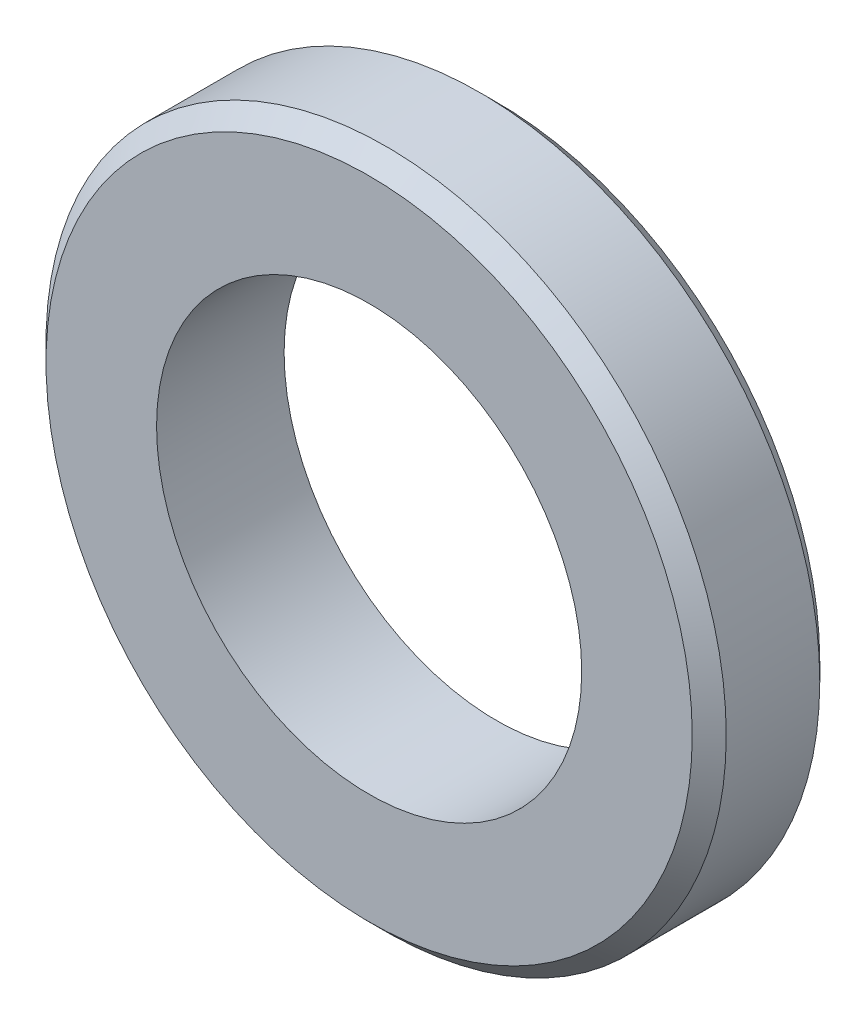
ISO-10303-21;
HEADER;
FILE_DESCRIPTION(('STEP AP214'),'2;1');
FILE_NAME('part.step','',(''),(''),'','','');
FILE_SCHEMA(('AUTOMOTIVE_DESIGN { 1 0 10303 214 1 1 1 1 }'));
ENDSEC;
DATA;
#1=APPLICATION_CONTEXT('core data for automotive mechanical design processes');
#2=APPLICATION_PROTOCOL_DEFINITION('international standard','automotive_design',2000,#1);
#3=PRODUCT_CONTEXT('',#1,'mechanical');
#4=PRODUCT('Part','Part','',(#3));
#5=PRODUCT_RELATED_PRODUCT_CATEGORY('part','',(#4));
#6=PRODUCT_DEFINITION_FORMATION('','',#4);
#7=PRODUCT_DEFINITION_CONTEXT('part definition',#1,'design');
#8=PRODUCT_DEFINITION('design','',#6,#7);
#9=PRODUCT_DEFINITION_SHAPE('','',#8);
#10=(LENGTH_UNIT() NAMED_UNIT(*) SI_UNIT(.MILLI.,.METRE.));
#11=(NAMED_UNIT(*) PLANE_ANGLE_UNIT() SI_UNIT($,.RADIAN.));
#12=(NAMED_UNIT(*) SI_UNIT($,.STERADIAN.) SOLID_ANGLE_UNIT());
#13=UNCERTAINTY_MEASURE_WITH_UNIT(LENGTH_MEASURE(1.E-05),#10,'distance_accuracy_value','');
#14=(GEOMETRIC_REPRESENTATION_CONTEXT(3) GLOBAL_UNCERTAINTY_ASSIGNED_CONTEXT((#13)) GLOBAL_UNIT_ASSIGNED_CONTEXT((#10,
#11,#12)) REPRESENTATION_CONTEXT('',''));
#15=CARTESIAN_POINT('',(0.,0.,0.));
#16=DIRECTION('',(0.,0.,1.));
#17=DIRECTION('',(1.,0.,0.));
#18=AXIS2_PLACEMENT_3D('',#15,#16,#17);
#19=CARTESIAN_POINT('',(0.,0.,3.));
#20=DIRECTION('',(0.,0.,1.));
#21=DIRECTION('',(1.,0.,0.));
#22=AXIS2_PLACEMENT_3D('',#19,#20,#21);
#23=PLANE('',#22);
#24=CARTESIAN_POINT('',(0.,0.,3.));
#25=DIRECTION('',(0.,0.,1.));
#26=DIRECTION('',(1.,0.,0.));
#27=AXIS2_PLACEMENT_3D('',#24,#25,#26);
#28=CIRCLE('',#27,7.60000000000001);
#29=CARTESIAN_POINT('',(7.60000000000001,0.,3.));
#30=VERTEX_POINT('',#29);
#31=EDGE_CURVE('E10',#30,#30,#28,.T.);
#32=ORIENTED_EDGE('',*,*,#31,.T.);
#33=EDGE_LOOP('',(#32));
#34=FACE_BOUND('',#33,.T.);
#35=CARTESIAN_POINT('',(0.,0.,3.));
#36=DIRECTION('',(0.,0.,1.));
#37=DIRECTION('',(1.,0.,0.));
#38=AXIS2_PLACEMENT_3D('',#35,#36,#37);
#39=CIRCLE('',#38,5.);
#40=CARTESIAN_POINT('',(5.,0.,3.));
#41=VERTEX_POINT('',#40);
#42=EDGE_CURVE('E70',#41,#41,#39,.T.);
#43=ORIENTED_EDGE('',*,*,#42,.F.);
#44=EDGE_LOOP('',(#43));
#45=FACE_BOUND('',#44,.T.);
#46=ADVANCED_FACE('F45',(#34,#45),#23,.T.);
#47=CARTESIAN_POINT('',(0.,0.,0.));
#48=DIRECTION('',(0.,0.,1.));
#49=DIRECTION('',(1.,0.,0.));
#50=AXIS2_PLACEMENT_3D('',#47,#48,#49);
#51=PLANE('',#50);
#52=CARTESIAN_POINT('',(0.,0.,0.));
#53=DIRECTION('',(0.,0.,1.));
#54=DIRECTION('',(1.,0.,0.));
#55=AXIS2_PLACEMENT_3D('',#52,#53,#54);
#56=CIRCLE('',#55,7.6);
#57=CARTESIAN_POINT('',(7.6,0.,0.));
#58=VERTEX_POINT('',#57);
#59=EDGE_CURVE('E54',#58,#58,#56,.F.);
#60=ORIENTED_EDGE('',*,*,#59,.T.);
#61=EDGE_LOOP('',(#60));
#62=FACE_BOUND('',#61,.T.);
#63=CARTESIAN_POINT('',(0.,0.,0.));
#64=DIRECTION('',(0.,0.,1.));
#65=DIRECTION('',(1.,0.,0.));
#66=AXIS2_PLACEMENT_3D('',#63,#64,#65);
#67=CIRCLE('',#66,5.);
#68=CARTESIAN_POINT('',(5.,0.,0.));
#69=VERTEX_POINT('',#68);
#70=EDGE_CURVE('E71',#69,#69,#67,.T.);
#71=ORIENTED_EDGE('',*,*,#70,.T.);
#72=EDGE_LOOP('',(#71));
#73=FACE_BOUND('',#72,.T.);
#74=ADVANCED_FACE('F83',(#62,#73),#51,.F.);
#75=CARTESIAN_POINT('',(0.,0.,3.));
#76=DIRECTION('',(0.,0.,-1.));
#77=DIRECTION('',(-1.,0.,0.));
#78=AXIS2_PLACEMENT_3D('',#75,#76,#77);
#79=CYLINDRICAL_SURFACE('',#78,8.);
#80=CARTESIAN_POINT('',(0.,0.,0.399999999999998));
#81=DIRECTION('',(0.,0.,1.));
#82=DIRECTION('',(1.,0.,0.));
#83=AXIS2_PLACEMENT_3D('',#80,#81,#82);
#84=CIRCLE('',#83,8.);
#85=CARTESIAN_POINT('',(8.,0.,0.399999999999998));
#86=VERTEX_POINT('',#85);
#87=EDGE_CURVE('E59',#86,#86,#84,.T.);
#88=ORIENTED_EDGE('',*,*,#87,.T.);
#89=EDGE_LOOP('',(#88));
#90=FACE_BOUND('',#89,.T.);
#91=CARTESIAN_POINT('',(0.,0.,2.60000000000001));
#92=DIRECTION('',(0.,0.,1.));
#93=DIRECTION('',(1.,0.,0.));
#94=AXIS2_PLACEMENT_3D('',#91,#92,#93);
#95=CIRCLE('',#94,8.);
#96=CARTESIAN_POINT('',(8.,0.,2.60000000000001));
#97=VERTEX_POINT('',#96);
#98=EDGE_CURVE('E64',#97,#97,#95,.F.);
#99=ORIENTED_EDGE('',*,*,#98,.T.);
#100=EDGE_LOOP('',(#99));
#101=FACE_BOUND('',#100,.T.);
#102=ADVANCED_FACE('F89',(#90,#101),#79,.T.);
#103=CARTESIAN_POINT('',(0.,0.,3.));
#104=DIRECTION('',(0.,0.,-1.));
#105=DIRECTION('',(-1.,0.,0.));
#106=AXIS2_PLACEMENT_3D('',#103,#104,#105);
#107=CYLINDRICAL_SURFACE('',#106,5.);
#108=ORIENTED_EDGE('',*,*,#42,.T.);
#109=EDGE_LOOP('',(#108));
#110=FACE_BOUND('',#109,.T.);
#111=ORIENTED_EDGE('',*,*,#70,.F.);
#112=EDGE_LOOP('',(#111));
#113=FACE_BOUND('',#112,.T.);
#114=ADVANCED_FACE('F79',(#110,#113),#107,.F.);
#115=CARTESIAN_POINT('',(0.,0.,0.399999999999998));
#116=DIRECTION('',(0.,0.,1.));
#117=DIRECTION('',(1.,0.,0.));
#118=AXIS2_PLACEMENT_3D('',#115,#116,#117);
#119=CONICAL_SURFACE('',#118,8.,0.78539816339745);
#120=ORIENTED_EDGE('',*,*,#59,.F.);
#121=EDGE_LOOP('',(#120));
#122=FACE_BOUND('',#121,.T.);
#123=ORIENTED_EDGE('',*,*,#87,.F.);
#124=EDGE_LOOP('',(#123));
#125=FACE_BOUND('',#124,.T.);
#126=ADVANCED_FACE('F96',(#122,#125),#119,.T.);
#127=CARTESIAN_POINT('',(0.,0.,3.));
#128=DIRECTION('',(0.,0.,-1.));
#129=DIRECTION('',(-1.,0.,0.));
#130=AXIS2_PLACEMENT_3D('',#127,#128,#129);
#131=CONICAL_SURFACE('',#130,7.60000000000001,0.785398163397448);
#132=ORIENTED_EDGE('',*,*,#98,.F.);
#133=EDGE_LOOP('',(#132));
#134=FACE_BOUND('',#133,.T.);
#135=ORIENTED_EDGE('',*,*,#31,.F.);
#136=EDGE_LOOP('',(#135));
#137=FACE_BOUND('',#136,.T.);
#138=ADVANCED_FACE('F48',(#134,#137),#131,.T.);
#139=CLOSED_SHELL('',(#46,#74,#102,#114,#126,#138));
#140=MANIFOLD_SOLID_BREP('B2',#139);
#141=ADVANCED_BREP_SHAPE_REPRESENTATION('',(#18,#140),#14);
#142=SHAPE_DEFINITION_REPRESENTATION(#9,#141);
ENDSEC;
END-ISO-10303-21;
